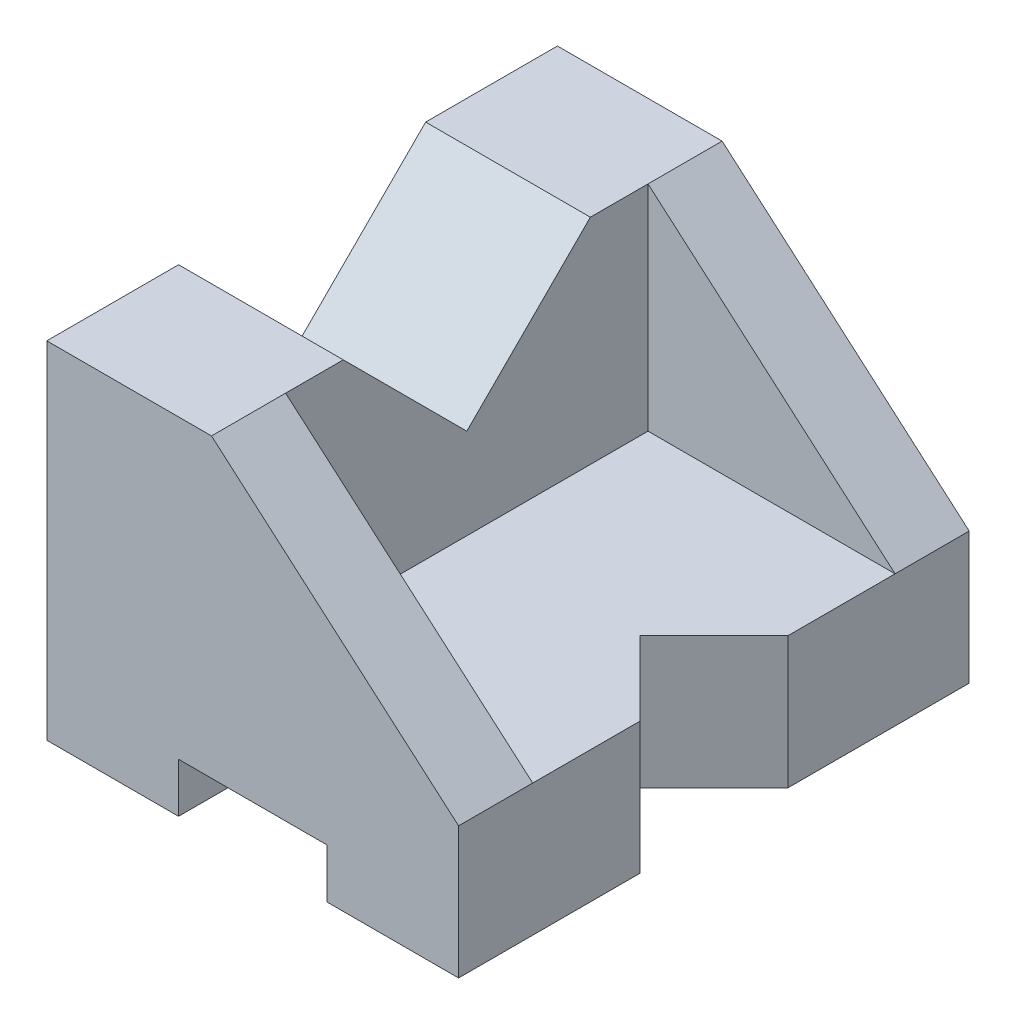
ISO-10303-21;
HEADER;
FILE_DESCRIPTION(('STEP AP214'),'2;1');
FILE_NAME('part.step','',(''),(''),'','','');
FILE_SCHEMA(('AUTOMOTIVE_DESIGN { 1 0 10303 214 1 1 1 1 }'));
ENDSEC;
DATA;
#1=APPLICATION_CONTEXT('core data for automotive mechanical design processes');
#2=APPLICATION_PROTOCOL_DEFINITION('international standard','automotive_design',2000,#1);
#3=PRODUCT_CONTEXT('',#1,'mechanical');
#4=PRODUCT('Part','Part','',(#3));
#5=PRODUCT_RELATED_PRODUCT_CATEGORY('part','',(#4));
#6=PRODUCT_DEFINITION_FORMATION('','',#4);
#7=PRODUCT_DEFINITION_CONTEXT('part definition',#1,'design');
#8=PRODUCT_DEFINITION('design','',#6,#7);
#9=PRODUCT_DEFINITION_SHAPE('','',#8);
#10=(LENGTH_UNIT() NAMED_UNIT(*) SI_UNIT(.MILLI.,.METRE.));
#11=(NAMED_UNIT(*) PLANE_ANGLE_UNIT() SI_UNIT($,.RADIAN.));
#12=(NAMED_UNIT(*) SI_UNIT($,.STERADIAN.) SOLID_ANGLE_UNIT());
#13=UNCERTAINTY_MEASURE_WITH_UNIT(LENGTH_MEASURE(1.E-05),#10,'distance_accuracy_value','');
#14=(GEOMETRIC_REPRESENTATION_CONTEXT(3) GLOBAL_UNCERTAINTY_ASSIGNED_CONTEXT((#13)) GLOBAL_UNIT_ASSIGNED_CONTEXT((#10,
#11,#12)) REPRESENTATION_CONTEXT('',''));
#15=CARTESIAN_POINT('',(0.,0.,0.));
#16=DIRECTION('',(0.,0.,1.));
#17=DIRECTION('',(1.,0.,0.));
#18=AXIS2_PLACEMENT_3D('',#15,#16,#17);
#19=CARTESIAN_POINT('',(50.,0.,31.));
#20=DIRECTION('',(-1.,0.,0.));
#21=DIRECTION('',(0.,0.,1.));
#22=AXIS2_PLACEMENT_3D('',#19,#20,#21);
#23=PLANE('',#22);
#24=DIRECTION('',(0.,0.,-1.));
#25=VECTOR('',#24,1.);
#26=CARTESIAN_POINT('',(50.,0.,31.));
#27=LINE('',#26,#25);
#28=CARTESIAN_POINT('',(50.,0.,31.));
#29=VERTEX_POINT('',#28);
#30=CARTESIAN_POINT('',(50.,0.,9.));
#31=VERTEX_POINT('',#30);
#32=EDGE_CURVE('E200',#29,#31,#27,.T.);
#33=ORIENTED_EDGE('',*,*,#32,.T.);
#34=DIRECTION('',(0.,1.,0.));
#35=VECTOR('',#34,1.);
#36=CARTESIAN_POINT('',(50.,0.,9.));
#37=LINE('',#36,#35);
#38=CARTESIAN_POINT('',(50.,16.,9.));
#39=VERTEX_POINT('',#38);
#40=EDGE_CURVE('E11',#31,#39,#37,.T.);
#41=ORIENTED_EDGE('',*,*,#40,.T.);
#42=DIRECTION('',(0.,0.,-1.));
#43=VECTOR('',#42,1.);
#44=CARTESIAN_POINT('',(50.,16.,31.));
#45=LINE('',#44,#43);
#46=CARTESIAN_POINT('',(50.,16.,22.));
#47=VERTEX_POINT('',#46);
#48=EDGE_CURVE('E185',#47,#39,#45,.T.);
#49=ORIENTED_EDGE('',*,*,#48,.F.);
#50=CARTESIAN_POINT('',(50.,16.,31.));
#51=VERTEX_POINT('',#50);
#52=EDGE_CURVE('E188',#51,#47,#45,.T.);
#53=ORIENTED_EDGE('',*,*,#52,.F.);
#54=DIRECTION('',(0.,1.,0.));
#55=VECTOR('',#54,1.);
#56=CARTESIAN_POINT('',(50.,0.,31.));
#57=LINE('',#56,#55);
#58=EDGE_CURVE('E186',#29,#51,#57,.T.);
#59=ORIENTED_EDGE('',*,*,#58,.F.);
#60=EDGE_LOOP('',(#33,#41,#49,#53,#59));
#61=FACE_BOUND('',#60,.T.);
#62=ADVANCED_FACE('F41',(#61),#23,.F.);
#63=CARTESIAN_POINT('',(0.,42.,31.));
#64=DIRECTION('',(0.,-1.,0.));
#65=DIRECTION('',(0.,0.,-1.));
#66=AXIS2_PLACEMENT_3D('',#63,#64,#65);
#67=PLANE('',#66);
#68=DIRECTION('',(0.,0.,-1.));
#69=VECTOR('',#68,1.);
#70=CARTESIAN_POINT('',(20.,42.,31.));
#71=LINE('',#70,#69);
#72=CARTESIAN_POINT('',(20.,42.,22.));
#73=VERTEX_POINT('',#72);
#74=CARTESIAN_POINT('',(20.,42.,15.));
#75=VERTEX_POINT('',#74);
#76=EDGE_CURVE('E228',#73,#75,#71,.T.);
#77=ORIENTED_EDGE('',*,*,#76,.T.);
#78=DIRECTION('',(1.,0.,0.));
#79=VECTOR('',#78,1.);
#80=CARTESIAN_POINT('',(-19.,42.,15.));
#81=LINE('',#80,#79);
#82=CARTESIAN_POINT('',(0.,42.,15.));
#83=VERTEX_POINT('',#82);
#84=EDGE_CURVE('E244',#83,#75,#81,.T.);
#85=ORIENTED_EDGE('',*,*,#84,.F.);
#86=DIRECTION('',(0.,0.,-1.));
#87=VECTOR('',#86,1.);
#88=CARTESIAN_POINT('',(0.,42.,31.));
#89=LINE('',#88,#87);
#90=CARTESIAN_POINT('',(0.,42.,31.));
#91=VERTEX_POINT('',#90);
#92=EDGE_CURVE('E220',#91,#83,#89,.T.);
#93=ORIENTED_EDGE('',*,*,#92,.F.);
#94=DIRECTION('',(-1.,0.,0.));
#95=VECTOR('',#94,1.);
#96=CARTESIAN_POINT('',(0.,42.,31.));
#97=LINE('',#96,#95);
#98=CARTESIAN_POINT('',(20.,42.,31.));
#99=VERTEX_POINT('',#98);
#100=EDGE_CURVE('E280',#99,#91,#97,.T.);
#101=ORIENTED_EDGE('',*,*,#100,.F.);
#102=EDGE_CURVE('E224',#99,#73,#71,.T.);
#103=ORIENTED_EDGE('',*,*,#102,.T.);
#104=EDGE_LOOP('',(#77,#85,#93,#101,#103));
#105=FACE_BOUND('',#104,.T.);
#106=ADVANCED_FACE('F249',(#105),#67,.F.);
#107=CARTESIAN_POINT('',(0.,16.,31.));
#108=DIRECTION('',(0.,1.,0.));
#109=DIRECTION('',(0.,0.,1.));
#110=AXIS2_PLACEMENT_3D('',#107,#108,#109);
#111=PLANE('',#110);
#112=DIRECTION('',(0.707106781186547,0.,0.707106781186547));
#113=VECTOR('',#112,1.);
#114=CARTESIAN_POINT('',(41.,16.,0.));
#115=LINE('',#114,#113);
#116=CARTESIAN_POINT('',(41.,16.,0.));
#117=VERTEX_POINT('',#116);
#118=EDGE_CURVE('E178',#117,#39,#115,.T.);
#119=ORIENTED_EDGE('',*,*,#118,.F.);
#120=DIRECTION('',(-0.707106781186547,0.,0.707106781186548));
#121=VECTOR('',#120,1.);
#122=CARTESIAN_POINT('',(50.,16.,-9.));
#123=LINE('',#122,#121);
#124=CARTESIAN_POINT('',(50.,16.,-9.));
#125=VERTEX_POINT('',#124);
#126=EDGE_CURVE('E167',#125,#117,#123,.T.);
#127=ORIENTED_EDGE('',*,*,#126,.F.);
#128=CARTESIAN_POINT('',(50.,16.,-22.));
#129=VERTEX_POINT('',#128);
#130=EDGE_CURVE('E175',#125,#129,#45,.T.);
#131=ORIENTED_EDGE('',*,*,#130,.T.);
#132=DIRECTION('',(1.,0.,0.));
#133=VECTOR('',#132,1.);
#134=CARTESIAN_POINT('',(0.,16.,-22.));
#135=LINE('',#134,#133);
#136=CARTESIAN_POINT('',(20.,16.,-22.));
#137=VERTEX_POINT('',#136);
#138=EDGE_CURVE('E252',#137,#129,#135,.T.);
#139=ORIENTED_EDGE('',*,*,#138,.F.);
#140=DIRECTION('',(0.,0.,-1.));
#141=VECTOR('',#140,1.);
#142=CARTESIAN_POINT('',(20.,16.,31.));
#143=LINE('',#142,#141);
#144=CARTESIAN_POINT('',(20.,16.,22.));
#145=VERTEX_POINT('',#144);
#146=EDGE_CURVE('E227',#145,#137,#143,.T.);
#147=ORIENTED_EDGE('',*,*,#146,.F.);
#148=DIRECTION('',(1.,0.,0.));
#149=VECTOR('',#148,1.);
#150=CARTESIAN_POINT('',(0.,16.,22.));
#151=LINE('',#150,#149);
#152=EDGE_CURVE('E277',#145,#47,#151,.T.);
#153=ORIENTED_EDGE('',*,*,#152,.T.);
#154=ORIENTED_EDGE('',*,*,#48,.T.);
#155=EDGE_LOOP('',(#119,#127,#131,#139,#147,#153,#154));
#156=FACE_BOUND('',#155,.T.);
#157=ADVANCED_FACE('F43',(#156),#111,.T.);
#158=CARTESIAN_POINT('',(20.,0.,31.));
#159=DIRECTION('',(1.,0.,0.));
#160=DIRECTION('',(0.,0.,-1.));
#161=AXIS2_PLACEMENT_3D('',#158,#159,#160);
#162=PLANE('',#161);
#163=DIRECTION('',(0.,-0.707106781186547,-0.707106781186547));
#164=VECTOR('',#163,1.);
#165=CARTESIAN_POINT('',(20.,42.,15.));
#166=LINE('',#165,#164);
#167=CARTESIAN_POINT('',(20.,27.,0.));
#168=VERTEX_POINT('',#167);
#169=EDGE_CURVE('E345',#75,#168,#166,.T.);
#170=ORIENTED_EDGE('',*,*,#169,.F.);
#171=ORIENTED_EDGE('',*,*,#76,.F.);
#172=DIRECTION('',(0.,-1.,0.));
#173=VECTOR('',#172,1.);
#174=CARTESIAN_POINT('',(20.,0.,22.));
#175=LINE('',#174,#173);
#176=EDGE_CURVE('E269',#73,#145,#175,.T.);
#177=ORIENTED_EDGE('',*,*,#176,.T.);
#178=ORIENTED_EDGE('',*,*,#146,.T.);
#179=DIRECTION('',(0.,-1.,0.));
#180=VECTOR('',#179,1.);
#181=CARTESIAN_POINT('',(20.,0.,-22.));
#182=LINE('',#181,#180);
#183=CARTESIAN_POINT('',(20.,42.,-22.));
#184=VERTEX_POINT('',#183);
#185=EDGE_CURVE('E250',#184,#137,#182,.T.);
#186=ORIENTED_EDGE('',*,*,#185,.F.);
#187=CARTESIAN_POINT('',(20.,42.,-15.));
#188=VERTEX_POINT('',#187);
#189=EDGE_CURVE('E223',#188,#184,#71,.T.);
#190=ORIENTED_EDGE('',*,*,#189,.F.);
#191=DIRECTION('',(0.,0.707106781186547,-0.707106781186547));
#192=VECTOR('',#191,1.);
#193=CARTESIAN_POINT('',(20.,27.,0.));
#194=LINE('',#193,#192);
#195=EDGE_CURVE('E256',#168,#188,#194,.T.);
#196=ORIENTED_EDGE('',*,*,#195,.F.);
#197=EDGE_LOOP('',(#170,#171,#177,#178,#186,#190,#196));
#198=FACE_BOUND('',#197,.T.);
#199=ADVANCED_FACE('F323',(#198),#162,.T.);
#200=CARTESIAN_POINT('',(0.,42.,-15.));
#201=VERTEX_POINT('',#200);
#202=CARTESIAN_POINT('',(0.,42.,-31.));
#203=VERTEX_POINT('',#202);
#204=EDGE_CURVE('E219',#201,#203,#89,.T.);
#205=ORIENTED_EDGE('',*,*,#204,.F.);
#206=DIRECTION('',(1.,0.,0.));
#207=VECTOR('',#206,1.);
#208=CARTESIAN_POINT('',(-19.,42.,-15.));
#209=LINE('',#208,#207);
#210=EDGE_CURVE('E64',#201,#188,#209,.T.);
#211=ORIENTED_EDGE('',*,*,#210,.T.);
#212=ORIENTED_EDGE('',*,*,#189,.T.);
#213=DIRECTION('',(0.,0.,1.));
#214=VECTOR('',#213,1.);
#215=CARTESIAN_POINT('',(20.,42.,-31.));
#216=LINE('',#215,#214);
#217=CARTESIAN_POINT('',(20.,42.,-31.));
#218=VERTEX_POINT('',#217);
#219=EDGE_CURVE('E266',#218,#184,#216,.T.);
#220=ORIENTED_EDGE('',*,*,#219,.F.);
#221=DIRECTION('',(-1.,0.,0.));
#222=VECTOR('',#221,1.);
#223=CARTESIAN_POINT('',(0.,42.,-31.));
#224=LINE('',#223,#222);
#225=EDGE_CURVE('E274',#218,#203,#224,.T.);
#226=ORIENTED_EDGE('',*,*,#225,.T.);
#227=EDGE_LOOP('',(#205,#211,#212,#220,#226));
#228=FACE_BOUND('',#227,.T.);
#229=ADVANCED_FACE('F353',(#228),#67,.F.);
#230=CARTESIAN_POINT('',(0.,0.,31.));
#231=DIRECTION('',(1.,0.,0.));
#232=DIRECTION('',(0.,0.,-1.));
#233=AXIS2_PLACEMENT_3D('',#230,#231,#232);
#234=PLANE('',#233);
#235=ORIENTED_EDGE('',*,*,#92,.T.);
#236=DIRECTION('',(0.,-0.707106781186548,-0.707106781186548));
#237=VECTOR('',#236,1.);
#238=CARTESIAN_POINT('',(0.,29.,2.));
#239=LINE('',#238,#237);
#240=CARTESIAN_POINT('',(0.,27.,0.));
#241=VERTEX_POINT('',#240);
#242=EDGE_CURVE('E172',#83,#241,#239,.T.);
#243=ORIENTED_EDGE('',*,*,#242,.T.);
#244=DIRECTION('',(0.,0.707106781186548,-0.707106781186548));
#245=VECTOR('',#244,1.);
#246=CARTESIAN_POINT('',(0.,-2.,29.));
#247=LINE('',#246,#245);
#248=EDGE_CURVE('E231',#241,#201,#247,.T.);
#249=ORIENTED_EDGE('',*,*,#248,.T.);
#250=ORIENTED_EDGE('',*,*,#204,.T.);
#251=DIRECTION('',(0.,-1.,0.));
#252=VECTOR('',#251,1.);
#253=CARTESIAN_POINT('',(0.,0.,-31.));
#254=LINE('',#253,#252);
#255=CARTESIAN_POINT('',(0.,0.,-31.));
#256=VERTEX_POINT('',#255);
#257=EDGE_CURVE('E296',#203,#256,#254,.T.);
#258=ORIENTED_EDGE('',*,*,#257,.T.);
#259=DIRECTION('',(0.,0.,-1.));
#260=VECTOR('',#259,1.);
#261=CARTESIAN_POINT('',(0.,0.,31.));
#262=LINE('',#261,#260);
#263=CARTESIAN_POINT('',(0.,0.,31.));
#264=VERTEX_POINT('',#263);
#265=EDGE_CURVE('E216',#264,#256,#262,.T.);
#266=ORIENTED_EDGE('',*,*,#265,.F.);
#267=DIRECTION('',(0.,-1.,0.));
#268=VECTOR('',#267,1.);
#269=CARTESIAN_POINT('',(0.,0.,31.));
#270=LINE('',#269,#268);
#271=EDGE_CURVE('E282',#91,#264,#270,.T.);
#272=ORIENTED_EDGE('',*,*,#271,.F.);
#273=EDGE_LOOP('',(#235,#243,#249,#250,#258,#266,#272));
#274=FACE_BOUND('',#273,.T.);
#275=ADVANCED_FACE('F235',(#274),#234,.F.);
#276=CARTESIAN_POINT('',(0.,0.,31.));
#277=DIRECTION('',(0.,1.,0.));
#278=DIRECTION('',(0.,0.,1.));
#279=AXIS2_PLACEMENT_3D('',#276,#277,#278);
#280=PLANE('',#279);
#281=DIRECTION('',(1.,0.,0.));
#282=VECTOR('',#281,1.);
#283=CARTESIAN_POINT('',(0.,0.,-31.));
#284=LINE('',#283,#282);
#285=CARTESIAN_POINT('',(16.,0.,-31.));
#286=VERTEX_POINT('',#285);
#287=EDGE_CURVE('E298',#256,#286,#284,.T.);
#288=ORIENTED_EDGE('',*,*,#287,.T.);
#289=DIRECTION('',(0.,0.,-1.));
#290=VECTOR('',#289,1.);
#291=CARTESIAN_POINT('',(16.,0.,31.));
#292=LINE('',#291,#290);
#293=CARTESIAN_POINT('',(16.,0.,31.));
#294=VERTEX_POINT('',#293);
#295=EDGE_CURVE('E213',#294,#286,#292,.T.);
#296=ORIENTED_EDGE('',*,*,#295,.F.);
#297=DIRECTION('',(1.,0.,0.));
#298=VECTOR('',#297,1.);
#299=CARTESIAN_POINT('',(0.,0.,31.));
#300=LINE('',#299,#298);
#301=EDGE_CURVE('E285',#264,#294,#300,.T.);
#302=ORIENTED_EDGE('',*,*,#301,.F.);
#303=ORIENTED_EDGE('',*,*,#265,.T.);
#304=EDGE_LOOP('',(#288,#296,#302,#303));
#305=FACE_BOUND('',#304,.T.);
#306=ADVANCED_FACE('F358',(#305),#280,.F.);
#307=CARTESIAN_POINT('',(16.,0.,31.));
#308=DIRECTION('',(-1.,0.,0.));
#309=DIRECTION('',(0.,-1.,0.));
#310=AXIS2_PLACEMENT_3D('',#307,#308,#309);
#311=PLANE('',#310);
#312=DIRECTION('',(0.,1.,0.));
#313=VECTOR('',#312,1.);
#314=CARTESIAN_POINT('',(16.,0.,-31.));
#315=LINE('',#314,#313);
#316=CARTESIAN_POINT('',(16.,6.,-31.));
#317=VERTEX_POINT('',#316);
#318=EDGE_CURVE('E300',#286,#317,#315,.T.);
#319=ORIENTED_EDGE('',*,*,#318,.T.);
#320=DIRECTION('',(0.,0.,-1.));
#321=VECTOR('',#320,1.);
#322=CARTESIAN_POINT('',(16.,6.,31.));
#323=LINE('',#322,#321);
#324=CARTESIAN_POINT('',(16.,6.,31.));
#325=VERTEX_POINT('',#324);
#326=EDGE_CURVE('E210',#325,#317,#323,.T.);
#327=ORIENTED_EDGE('',*,*,#326,.F.);
#328=DIRECTION('',(0.,1.,0.));
#329=VECTOR('',#328,1.);
#330=CARTESIAN_POINT('',(16.,0.,31.));
#331=LINE('',#330,#329);
#332=EDGE_CURVE('E287',#294,#325,#331,.T.);
#333=ORIENTED_EDGE('',*,*,#332,.F.);
#334=ORIENTED_EDGE('',*,*,#295,.T.);
#335=EDGE_LOOP('',(#319,#327,#333,#334));
#336=FACE_BOUND('',#335,.T.);
#337=ADVANCED_FACE('F364',(#336),#311,.F.);
#338=CARTESIAN_POINT('',(0.,5.99999999999999,31.));
#339=DIRECTION('',(0.,1.,0.));
#340=DIRECTION('',(-1.,0.,0.));
#341=AXIS2_PLACEMENT_3D('',#338,#339,#340);
#342=PLANE('',#341);
#343=DIRECTION('',(1.,0.,0.));
#344=VECTOR('',#343,1.);
#345=CARTESIAN_POINT('',(0.,5.99999999999999,-31.));
#346=LINE('',#345,#344);
#347=CARTESIAN_POINT('',(34.,6.00000000000002,-31.));
#348=VERTEX_POINT('',#347);
#349=EDGE_CURVE('E302',#317,#348,#346,.T.);
#350=ORIENTED_EDGE('',*,*,#349,.T.);
#351=DIRECTION('',(0.,0.,-1.));
#352=VECTOR('',#351,1.);
#353=CARTESIAN_POINT('',(34.,6.00000000000002,31.));
#354=LINE('',#353,#352);
#355=CARTESIAN_POINT('',(34.,6.00000000000002,31.));
#356=VERTEX_POINT('',#355);
#357=EDGE_CURVE('E207',#356,#348,#354,.T.);
#358=ORIENTED_EDGE('',*,*,#357,.F.);
#359=DIRECTION('',(1.,0.,0.));
#360=VECTOR('',#359,1.);
#361=CARTESIAN_POINT('',(0.,5.99999999999999,31.));
#362=LINE('',#361,#360);
#363=EDGE_CURVE('E289',#325,#356,#362,.T.);
#364=ORIENTED_EDGE('',*,*,#363,.F.);
#365=ORIENTED_EDGE('',*,*,#326,.T.);
#366=EDGE_LOOP('',(#350,#358,#364,#365));
#367=FACE_BOUND('',#366,.T.);
#368=ADVANCED_FACE('F368',(#367),#342,.F.);
#369=CARTESIAN_POINT('',(34.,0.,31.));
#370=DIRECTION('',(1.,0.,0.));
#371=DIRECTION('',(0.,0.,-1.));
#372=AXIS2_PLACEMENT_3D('',#369,#370,#371);
#373=PLANE('',#372);
#374=DIRECTION('',(0.,-1.,0.));
#375=VECTOR('',#374,1.);
#376=CARTESIAN_POINT('',(34.,0.,-31.));
#377=LINE('',#376,#375);
#378=CARTESIAN_POINT('',(34.,0.,-31.));
#379=VERTEX_POINT('',#378);
#380=EDGE_CURVE('E304',#348,#379,#377,.T.);
#381=ORIENTED_EDGE('',*,*,#380,.T.);
#382=DIRECTION('',(0.,0.,-1.));
#383=VECTOR('',#382,1.);
#384=CARTESIAN_POINT('',(34.,0.,31.));
#385=LINE('',#384,#383);
#386=CARTESIAN_POINT('',(34.,0.,31.));
#387=VERTEX_POINT('',#386);
#388=EDGE_CURVE('E203',#387,#379,#385,.T.);
#389=ORIENTED_EDGE('',*,*,#388,.F.);
#390=DIRECTION('',(0.,-1.,0.));
#391=VECTOR('',#390,1.);
#392=CARTESIAN_POINT('',(34.,0.,31.));
#393=LINE('',#392,#391);
#394=EDGE_CURVE('E291',#356,#387,#393,.T.);
#395=ORIENTED_EDGE('',*,*,#394,.F.);
#396=ORIENTED_EDGE('',*,*,#357,.T.);
#397=EDGE_LOOP('',(#381,#389,#395,#396));
#398=FACE_BOUND('',#397,.T.);
#399=ADVANCED_FACE('F373',(#398),#373,.F.);
#400=CARTESIAN_POINT('',(0.,0.,31.));
#401=DIRECTION('',(0.,1.,0.));
#402=DIRECTION('',(-1.,0.,0.));
#403=AXIS2_PLACEMENT_3D('',#400,#401,#402);
#404=PLANE('',#403);
#405=DIRECTION('',(-0.707106781186547,0.,0.707106781186548));
#406=VECTOR('',#405,1.);
#407=CARTESIAN_POINT('',(5.00000000000002,0.,36.));
#408=LINE('',#407,#406);
#409=CARTESIAN_POINT('',(50.,0.,-9.00000000000001));
#410=VERTEX_POINT('',#409);
#411=CARTESIAN_POINT('',(41.,0.,0.));
#412=VERTEX_POINT('',#411);
#413=EDGE_CURVE('E56',#410,#412,#408,.T.);
#414=ORIENTED_EDGE('',*,*,#413,.T.);
#415=DIRECTION('',(0.707106781186548,0.,0.707106781186548));
#416=VECTOR('',#415,1.);
#417=CARTESIAN_POINT('',(36.,0.,-5.));
#418=LINE('',#417,#416);
#419=EDGE_CURVE('E342',#412,#31,#418,.T.);
#420=ORIENTED_EDGE('',*,*,#419,.T.);
#421=ORIENTED_EDGE('',*,*,#32,.F.);
#422=DIRECTION('',(1.,0.,0.));
#423=VECTOR('',#422,1.);
#424=CARTESIAN_POINT('',(0.,0.,31.));
#425=LINE('',#424,#423);
#426=EDGE_CURVE('E190',#387,#29,#425,.T.);
#427=ORIENTED_EDGE('',*,*,#426,.F.);
#428=ORIENTED_EDGE('',*,*,#388,.T.);
#429=DIRECTION('',(1.,0.,0.));
#430=VECTOR('',#429,1.);
#431=CARTESIAN_POINT('',(0.,0.,-31.));
#432=LINE('',#431,#430);
#433=CARTESIAN_POINT('',(50.,0.,-31.));
#434=VERTEX_POINT('',#433);
#435=EDGE_CURVE('E306',#379,#434,#432,.T.);
#436=ORIENTED_EDGE('',*,*,#435,.T.);
#437=EDGE_CURVE('E195',#410,#434,#27,.T.);
#438=ORIENTED_EDGE('',*,*,#437,.F.);
#439=EDGE_LOOP('',(#414,#420,#421,#427,#428,#436,#438));
#440=FACE_BOUND('',#439,.T.);
#441=ADVANCED_FACE('F344',(#440),#404,.F.);
#442=ORIENTED_EDGE('',*,*,#130,.F.);
#443=DIRECTION('',(0.,-1.,0.));
#444=VECTOR('',#443,1.);
#445=CARTESIAN_POINT('',(50.,0.,-9.00000000000001));
#446=LINE('',#445,#444);
#447=EDGE_CURVE('E49',#125,#410,#446,.T.);
#448=ORIENTED_EDGE('',*,*,#447,.T.);
#449=ORIENTED_EDGE('',*,*,#437,.T.);
#450=DIRECTION('',(0.,1.,0.));
#451=VECTOR('',#450,1.);
#452=CARTESIAN_POINT('',(50.,0.,-31.));
#453=LINE('',#452,#451);
#454=CARTESIAN_POINT('',(50.,16.,-31.));
#455=VERTEX_POINT('',#454);
#456=EDGE_CURVE('E283',#434,#455,#453,.T.);
#457=ORIENTED_EDGE('',*,*,#456,.T.);
#458=DIRECTION('',(0.,0.,1.));
#459=VECTOR('',#458,1.);
#460=CARTESIAN_POINT('',(50.,16.,-31.));
#461=LINE('',#460,#459);
#462=EDGE_CURVE('E184',#455,#129,#461,.T.);
#463=ORIENTED_EDGE('',*,*,#462,.T.);
#464=EDGE_LOOP('',(#442,#448,#449,#457,#463));
#465=FACE_BOUND('',#464,.T.);
#466=ADVANCED_FACE('F181',(#465),#23,.F.);
#467=CARTESIAN_POINT('',(0.,0.,31.));
#468=DIRECTION('',(0.,0.,1.));
#469=DIRECTION('',(1.,0.,0.));
#470=AXIS2_PLACEMENT_3D('',#467,#468,#469);
#471=PLANE('',#470);
#472=ORIENTED_EDGE('',*,*,#58,.T.);
#473=DIRECTION('',(-0.755689082789818,0.654930538417842,0.));
#474=VECTOR('',#473,1.);
#475=CARTESIAN_POINT('',(29.3654822335025,33.8832487309645,31.));
#476=LINE('',#475,#474);
#477=EDGE_CURVE('E271',#51,#99,#476,.T.);
#478=ORIENTED_EDGE('',*,*,#477,.T.);
#479=ORIENTED_EDGE('',*,*,#100,.T.);
#480=ORIENTED_EDGE('',*,*,#271,.T.);
#481=ORIENTED_EDGE('',*,*,#301,.T.);
#482=ORIENTED_EDGE('',*,*,#332,.T.);
#483=ORIENTED_EDGE('',*,*,#363,.T.);
#484=ORIENTED_EDGE('',*,*,#394,.T.);
#485=ORIENTED_EDGE('',*,*,#426,.T.);
#486=EDGE_LOOP('',(#472,#478,#479,#480,#481,#482,#483,#484,#485));
#487=FACE_BOUND('',#486,.T.);
#488=ADVANCED_FACE('F334',(#487),#471,.T.);
#489=CARTESIAN_POINT('',(0.,0.,-31.));
#490=DIRECTION('',(0.,0.,1.));
#491=DIRECTION('',(1.,0.,0.));
#492=AXIS2_PLACEMENT_3D('',#489,#490,#491);
#493=PLANE('',#492);
#494=ORIENTED_EDGE('',*,*,#225,.F.);
#495=DIRECTION('',(-0.755689082789818,0.654930538417842,0.));
#496=VECTOR('',#495,1.);
#497=CARTESIAN_POINT('',(29.3654822335025,33.8832487309645,-31.));
#498=LINE('',#497,#496);
#499=EDGE_CURVE('E260',#455,#218,#498,.T.);
#500=ORIENTED_EDGE('',*,*,#499,.F.);
#501=ORIENTED_EDGE('',*,*,#456,.F.);
#502=ORIENTED_EDGE('',*,*,#435,.F.);
#503=ORIENTED_EDGE('',*,*,#380,.F.);
#504=ORIENTED_EDGE('',*,*,#349,.F.);
#505=ORIENTED_EDGE('',*,*,#318,.F.);
#506=ORIENTED_EDGE('',*,*,#287,.F.);
#507=ORIENTED_EDGE('',*,*,#257,.F.);
#508=EDGE_LOOP('',(#494,#500,#501,#502,#503,#504,#505,#506,#507));
#509=FACE_BOUND('',#508,.T.);
#510=ADVANCED_FACE('F311',(#509),#493,.F.);
#511=CARTESIAN_POINT('',(29.3654822335025,33.8832487309645,31.));
#512=DIRECTION('',(-0.654930538417842,-0.755689082789818,0.));
#513=DIRECTION('',(0.755689082789818,-0.654930538417842,0.));
#514=AXIS2_PLACEMENT_3D('',#511,#512,#513);
#515=PLANE('',#514);
#516=DIRECTION('',(-0.755689082789818,0.654930538417842,0.));
#517=VECTOR('',#516,1.);
#518=CARTESIAN_POINT('',(29.3654822335025,33.8832487309645,22.));
#519=LINE('',#518,#517);
#520=EDGE_CURVE('E275',#47,#73,#519,.T.);
#521=ORIENTED_EDGE('',*,*,#520,.T.);
#522=ORIENTED_EDGE('',*,*,#102,.F.);
#523=ORIENTED_EDGE('',*,*,#477,.F.);
#524=ORIENTED_EDGE('',*,*,#52,.T.);
#525=EDGE_LOOP('',(#521,#522,#523,#524));
#526=FACE_BOUND('',#525,.T.);
#527=ADVANCED_FACE('F332',(#526),#515,.F.);
#528=CARTESIAN_POINT('',(0.,0.,22.));
#529=DIRECTION('',(0.,0.,1.));
#530=DIRECTION('',(1.,0.,0.));
#531=AXIS2_PLACEMENT_3D('',#528,#529,#530);
#532=PLANE('',#531);
#533=ORIENTED_EDGE('',*,*,#176,.F.);
#534=ORIENTED_EDGE('',*,*,#520,.F.);
#535=ORIENTED_EDGE('',*,*,#152,.F.);
#536=EDGE_LOOP('',(#533,#534,#535));
#537=FACE_BOUND('',#536,.T.);
#538=ADVANCED_FACE('F330',(#537),#532,.F.);
#539=CARTESIAN_POINT('',(29.3654822335025,33.8832487309645,-31.));
#540=DIRECTION('',(0.654930538417842,0.755689082789818,0.));
#541=DIRECTION('',(-0.755689082789818,0.654930538417842,0.));
#542=AXIS2_PLACEMENT_3D('',#539,#540,#541);
#543=PLANE('',#542);
#544=DIRECTION('',(-0.755689082789818,0.654930538417842,0.));
#545=VECTOR('',#544,1.);
#546=CARTESIAN_POINT('',(29.3654822335025,33.8832487309645,-22.));
#547=LINE('',#546,#545);
#548=EDGE_CURVE('E261',#129,#184,#547,.T.);
#549=ORIENTED_EDGE('',*,*,#548,.F.);
#550=ORIENTED_EDGE('',*,*,#462,.F.);
#551=ORIENTED_EDGE('',*,*,#499,.T.);
#552=ORIENTED_EDGE('',*,*,#219,.T.);
#553=EDGE_LOOP('',(#549,#550,#551,#552));
#554=FACE_BOUND('',#553,.T.);
#555=ADVANCED_FACE('F317',(#554),#543,.T.);
#556=CARTESIAN_POINT('',(0.,0.,-22.));
#557=DIRECTION('',(0.,0.,1.));
#558=DIRECTION('',(1.,0.,0.));
#559=AXIS2_PLACEMENT_3D('',#556,#557,#558);
#560=PLANE('',#559);
#561=ORIENTED_EDGE('',*,*,#185,.T.);
#562=ORIENTED_EDGE('',*,*,#138,.T.);
#563=ORIENTED_EDGE('',*,*,#548,.T.);
#564=EDGE_LOOP('',(#561,#562,#563));
#565=FACE_BOUND('',#564,.T.);
#566=ADVANCED_FACE('F320',(#565),#560,.T.);
#567=CARTESIAN_POINT('',(-19.,42.,15.));
#568=DIRECTION('',(0.,-0.707106781186548,0.707106781186548));
#569=DIRECTION('',(0.,-0.707106781186548,-0.707106781186548));
#570=AXIS2_PLACEMENT_3D('',#567,#568,#569);
#571=PLANE('',#570);
#572=ORIENTED_EDGE('',*,*,#84,.T.);
#573=ORIENTED_EDGE('',*,*,#169,.T.);
#574=DIRECTION('',(1.,0.,0.));
#575=VECTOR('',#574,1.);
#576=CARTESIAN_POINT('',(-19.,27.,0.));
#577=LINE('',#576,#575);
#578=EDGE_CURVE('E246',#241,#168,#577,.T.);
#579=ORIENTED_EDGE('',*,*,#578,.F.);
#580=ORIENTED_EDGE('',*,*,#242,.F.);
#581=EDGE_LOOP('',(#572,#573,#579,#580));
#582=FACE_BOUND('',#581,.T.);
#583=ADVANCED_FACE('F242',(#582),#571,.F.);
#584=CARTESIAN_POINT('',(-19.,27.,0.));
#585=DIRECTION('',(0.,-0.707106781186548,-0.707106781186548));
#586=DIRECTION('',(0.,0.707106781186548,-0.707106781186548));
#587=AXIS2_PLACEMENT_3D('',#584,#585,#586);
#588=PLANE('',#587);
#589=ORIENTED_EDGE('',*,*,#578,.T.);
#590=ORIENTED_EDGE('',*,*,#195,.T.);
#591=ORIENTED_EDGE('',*,*,#210,.F.);
#592=ORIENTED_EDGE('',*,*,#248,.F.);
#593=EDGE_LOOP('',(#589,#590,#591,#592));
#594=FACE_BOUND('',#593,.T.);
#595=ADVANCED_FACE('F351',(#594),#588,.F.);
#596=CARTESIAN_POINT('',(41.,-23.,0.));
#597=DIRECTION('',(-0.707106781186548,0.,0.707106781186548));
#598=DIRECTION('',(0.707106781186548,0.,0.707106781186548));
#599=AXIS2_PLACEMENT_3D('',#596,#597,#598);
#600=PLANE('',#599);
#601=DIRECTION('',(0.,1.,0.));
#602=VECTOR('',#601,1.);
#603=CARTESIAN_POINT('',(41.,-23.,0.));
#604=LINE('',#603,#602);
#605=EDGE_CURVE('E347',#412,#117,#604,.T.);
#606=ORIENTED_EDGE('',*,*,#605,.T.);
#607=ORIENTED_EDGE('',*,*,#118,.T.);
#608=ORIENTED_EDGE('',*,*,#40,.F.);
#609=ORIENTED_EDGE('',*,*,#419,.F.);
#610=EDGE_LOOP('',(#606,#607,#608,#609));
#611=FACE_BOUND('',#610,.T.);
#612=ADVANCED_FACE('F341',(#611),#600,.F.);
#613=CARTESIAN_POINT('',(50.,-23.,-9.));
#614=DIRECTION('',(-0.707106781186548,0.,-0.707106781186547));
#615=DIRECTION('',(-0.707106781186547,0.,0.707106781186548));
#616=AXIS2_PLACEMENT_3D('',#613,#614,#615);
#617=PLANE('',#616);
#618=ORIENTED_EDGE('',*,*,#447,.F.);
#619=ORIENTED_EDGE('',*,*,#126,.T.);
#620=ORIENTED_EDGE('',*,*,#605,.F.);
#621=ORIENTED_EDGE('',*,*,#413,.F.);
#622=EDGE_LOOP('',(#618,#619,#620,#621));
#623=FACE_BOUND('',#622,.T.);
#624=ADVANCED_FACE('F166',(#623),#617,.F.);
#625=CLOSED_SHELL('',(#62,#106,#157,#199,#229,#275,#306,#337,#368,#399,#441,#466,#488,#510,#527,
#538,#555,#566,#583,#595,#612,#624));
#626=MANIFOLD_SOLID_BREP('B2',#625);
#627=ADVANCED_BREP_SHAPE_REPRESENTATION('',(#18,#626),#14);
#628=SHAPE_DEFINITION_REPRESENTATION(#9,#627);
ENDSEC;
END-ISO-10303-21;
